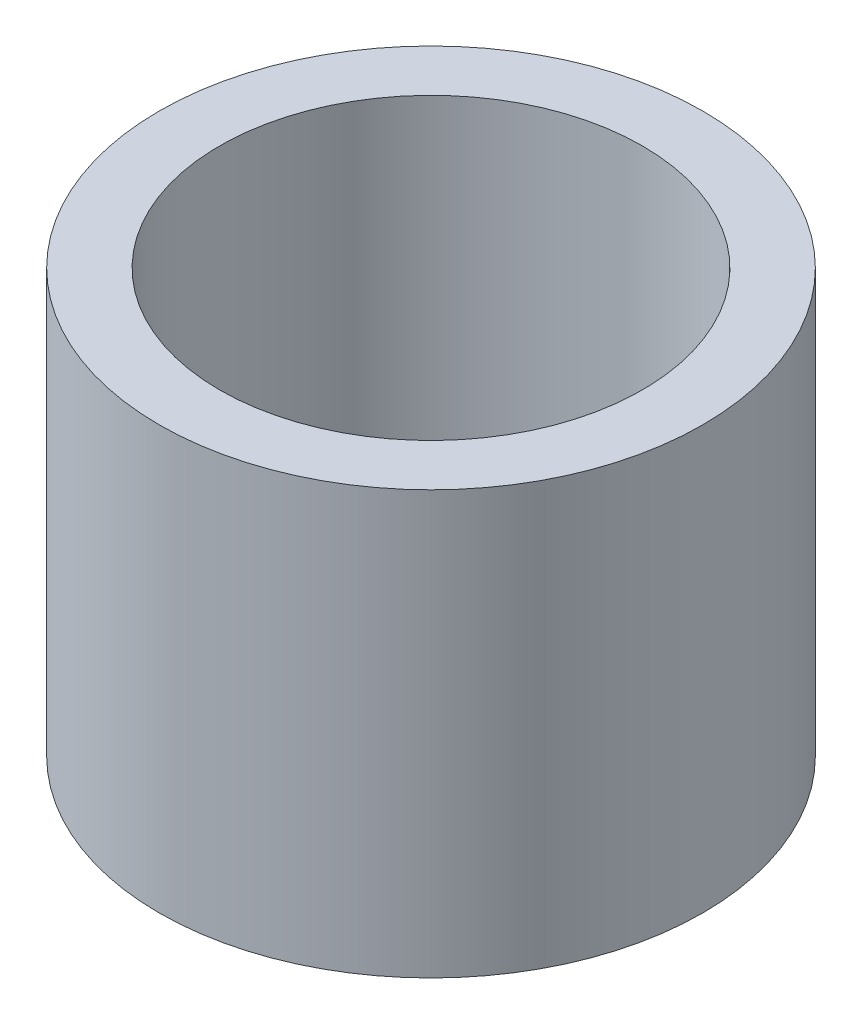
ISO-10303-21;
HEADER;
FILE_DESCRIPTION(('STEP AP214'),'2;1');
FILE_NAME('part.step','',(''),(''),'','','');
FILE_SCHEMA(('AUTOMOTIVE_DESIGN { 1 0 10303 214 1 1 1 1 }'));
ENDSEC;
DATA;
#1=APPLICATION_CONTEXT('core data for automotive mechanical design processes');
#2=APPLICATION_PROTOCOL_DEFINITION('international standard','automotive_design',2000,#1);
#3=PRODUCT_CONTEXT('',#1,'mechanical');
#4=PRODUCT('Part','Part','',(#3));
#5=PRODUCT_RELATED_PRODUCT_CATEGORY('part','',(#4));
#6=PRODUCT_DEFINITION_FORMATION('','',#4);
#7=PRODUCT_DEFINITION_CONTEXT('part definition',#1,'design');
#8=PRODUCT_DEFINITION('design','',#6,#7);
#9=PRODUCT_DEFINITION_SHAPE('','',#8);
#10=(LENGTH_UNIT() NAMED_UNIT(*) SI_UNIT(.MILLI.,.METRE.));
#11=(NAMED_UNIT(*) PLANE_ANGLE_UNIT() SI_UNIT($,.RADIAN.));
#12=(NAMED_UNIT(*) SI_UNIT($,.STERADIAN.) SOLID_ANGLE_UNIT());
#13=UNCERTAINTY_MEASURE_WITH_UNIT(LENGTH_MEASURE(1.E-05),#10,'distance_accuracy_value','');
#14=(GEOMETRIC_REPRESENTATION_CONTEXT(3) GLOBAL_UNCERTAINTY_ASSIGNED_CONTEXT((#13)) GLOBAL_UNIT_ASSIGNED_CONTEXT((#10,
#11,#12)) REPRESENTATION_CONTEXT('',''));
#15=CARTESIAN_POINT('',(0.,0.,0.));
#16=DIRECTION('',(0.,0.,1.));
#17=DIRECTION('',(1.,0.,0.));
#18=AXIS2_PLACEMENT_3D('',#15,#16,#17);
#19=CARTESIAN_POINT('',(0.,3.5,0.));
#20=DIRECTION('',(0.,1.,0.));
#21=DIRECTION('',(0.,0.,1.));
#22=AXIS2_PLACEMENT_3D('',#19,#20,#21);
#23=PLANE('',#22);
#24=CARTESIAN_POINT('',(0.,3.5,0.));
#25=DIRECTION('',(0.,1.,0.));
#26=DIRECTION('',(0.,0.,1.));
#27=AXIS2_PLACEMENT_3D('',#24,#25,#26);
#28=CIRCLE('',#27,2.25);
#29=CARTESIAN_POINT('',(0.,3.5,2.25));
#30=VERTEX_POINT('',#29);
#31=EDGE_CURVE('E10',#30,#30,#28,.T.);
#32=ORIENTED_EDGE('',*,*,#31,.T.);
#33=EDGE_LOOP('',(#32));
#34=FACE_BOUND('',#33,.T.);
#35=CARTESIAN_POINT('',(0.,3.5,0.));
#36=DIRECTION('',(0.,1.,0.));
#37=DIRECTION('',(0.,0.,1.));
#38=AXIS2_PLACEMENT_3D('',#35,#36,#37);
#39=CIRCLE('',#38,1.75);
#40=CARTESIAN_POINT('',(0.,3.5,1.75));
#41=VERTEX_POINT('',#40);
#42=EDGE_CURVE('E51',#41,#41,#39,.T.);
#43=ORIENTED_EDGE('',*,*,#42,.F.);
#44=EDGE_LOOP('',(#43));
#45=FACE_BOUND('',#44,.T.);
#46=ADVANCED_FACE('F36',(#34,#45),#23,.T.);
#47=CARTESIAN_POINT('',(0.,0.,0.));
#48=DIRECTION('',(0.,1.,0.));
#49=DIRECTION('',(0.,0.,1.));
#50=AXIS2_PLACEMENT_3D('',#47,#48,#49);
#51=PLANE('',#50);
#52=CARTESIAN_POINT('',(0.,0.,0.));
#53=DIRECTION('',(0.,1.,0.));
#54=DIRECTION('',(0.,0.,1.));
#55=AXIS2_PLACEMENT_3D('',#52,#53,#54);
#56=CIRCLE('',#55,2.25);
#57=CARTESIAN_POINT('',(0.,0.,2.25));
#58=VERTEX_POINT('',#57);
#59=EDGE_CURVE('E40',#58,#58,#56,.T.);
#60=ORIENTED_EDGE('',*,*,#59,.F.);
#61=EDGE_LOOP('',(#60));
#62=FACE_BOUND('',#61,.T.);
#63=CARTESIAN_POINT('',(0.,0.,0.));
#64=DIRECTION('',(0.,1.,0.));
#65=DIRECTION('',(0.,0.,1.));
#66=AXIS2_PLACEMENT_3D('',#63,#64,#65);
#67=CIRCLE('',#66,1.75);
#68=CARTESIAN_POINT('',(0.,0.,1.75));
#69=VERTEX_POINT('',#68);
#70=EDGE_CURVE('E53',#69,#69,#67,.T.);
#71=ORIENTED_EDGE('',*,*,#70,.T.);
#72=EDGE_LOOP('',(#71));
#73=FACE_BOUND('',#72,.T.);
#74=ADVANCED_FACE('F63',(#62,#73),#51,.F.);
#75=CARTESIAN_POINT('',(0.,3.5,0.));
#76=DIRECTION('',(0.,-1.,0.));
#77=DIRECTION('',(0.,0.,-1.));
#78=AXIS2_PLACEMENT_3D('',#75,#76,#77);
#79=CYLINDRICAL_SURFACE('',#78,2.25);
#80=ORIENTED_EDGE('',*,*,#31,.F.);
#81=EDGE_LOOP('',(#80));
#82=FACE_BOUND('',#81,.T.);
#83=ORIENTED_EDGE('',*,*,#59,.T.);
#84=EDGE_LOOP('',(#83));
#85=FACE_BOUND('',#84,.T.);
#86=ADVANCED_FACE('F38',(#82,#85),#79,.T.);
#87=CARTESIAN_POINT('',(0.,3.5,0.));
#88=DIRECTION('',(0.,-1.,0.));
#89=DIRECTION('',(0.,0.,-1.));
#90=AXIS2_PLACEMENT_3D('',#87,#88,#89);
#91=CYLINDRICAL_SURFACE('',#90,1.75);
#92=ORIENTED_EDGE('',*,*,#42,.T.);
#93=EDGE_LOOP('',(#92));
#94=FACE_BOUND('',#93,.T.);
#95=ORIENTED_EDGE('',*,*,#70,.F.);
#96=EDGE_LOOP('',(#95));
#97=FACE_BOUND('',#96,.T.);
#98=ADVANCED_FACE('F59',(#94,#97),#91,.F.);
#99=CLOSED_SHELL('',(#46,#74,#86,#98));
#100=MANIFOLD_SOLID_BREP('B2',#99);
#101=ADVANCED_BREP_SHAPE_REPRESENTATION('',(#18,#100),#14);
#102=SHAPE_DEFINITION_REPRESENTATION(#9,#101);
ENDSEC;
END-ISO-10303-21;
